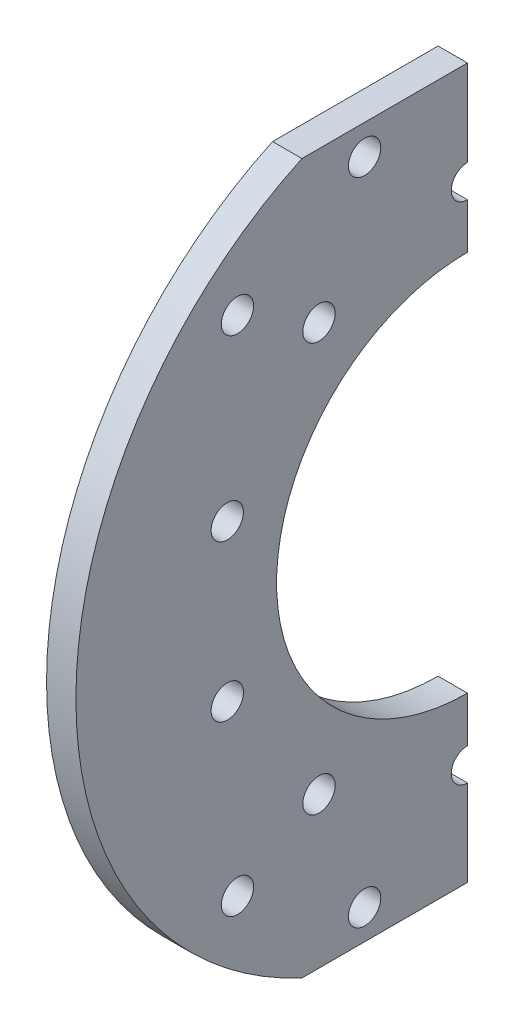
ISO-10303-21;
HEADER;
FILE_DESCRIPTION(('STEP AP214'),'2;1');
FILE_NAME('part.step','',(''),(''),'','','');
FILE_SCHEMA(('AUTOMOTIVE_DESIGN { 1 0 10303 214 1 1 1 1 }'));
ENDSEC;
DATA;
#1=APPLICATION_CONTEXT('core data for automotive mechanical design processes');
#2=APPLICATION_PROTOCOL_DEFINITION('international standard','automotive_design',2000,#1);
#3=PRODUCT_CONTEXT('',#1,'mechanical');
#4=PRODUCT('Part','Part','',(#3));
#5=PRODUCT_RELATED_PRODUCT_CATEGORY('part','',(#4));
#6=PRODUCT_DEFINITION_FORMATION('','',#4);
#7=PRODUCT_DEFINITION_CONTEXT('part definition',#1,'design');
#8=PRODUCT_DEFINITION('design','',#6,#7);
#9=PRODUCT_DEFINITION_SHAPE('','',#8);
#10=(LENGTH_UNIT() NAMED_UNIT(*) SI_UNIT(.MILLI.,.METRE.));
#11=(NAMED_UNIT(*) PLANE_ANGLE_UNIT() SI_UNIT($,.RADIAN.));
#12=(NAMED_UNIT(*) SI_UNIT($,.STERADIAN.) SOLID_ANGLE_UNIT());
#13=UNCERTAINTY_MEASURE_WITH_UNIT(LENGTH_MEASURE(1.E-05),#10,'distance_accuracy_value','');
#14=(GEOMETRIC_REPRESENTATION_CONTEXT(3) GLOBAL_UNCERTAINTY_ASSIGNED_CONTEXT((#13)) GLOBAL_UNIT_ASSIGNED_CONTEXT((#10,
#11,#12)) REPRESENTATION_CONTEXT('',''));
#15=CARTESIAN_POINT('',(0.,0.,0.));
#16=DIRECTION('',(0.,0.,1.));
#17=DIRECTION('',(1.,0.,0.));
#18=AXIS2_PLACEMENT_3D('',#15,#16,#17);
#19=CARTESIAN_POINT('',(0.,0.,0.));
#20=DIRECTION('',(0.,0.,1.));
#21=DIRECTION('',(1.,0.,0.));
#22=AXIS2_PLACEMENT_3D('',#19,#20,#21);
#23=PLANE('',#22);
#24=DIRECTION('',(0.,-1.,0.));
#25=VECTOR('',#24,1.);
#26=CARTESIAN_POINT('',(6.,0.,0.));
#27=LINE('',#26,#25);
#28=CARTESIAN_POINT('',(6.,72.5,0.));
#29=VERTEX_POINT('',#28);
#30=CARTESIAN_POINT('',(6.,54.9,0.));
#31=VERTEX_POINT('',#30);
#32=EDGE_CURVE('E45',#29,#31,#27,.T.);
#33=ORIENTED_EDGE('',*,*,#32,.T.);
#34=DIRECTION('',(-1.,0.,0.));
#35=VECTOR('',#34,1.);
#36=CARTESIAN_POINT('',(6.,54.9,0.));
#37=LINE('',#36,#35);
#38=CARTESIAN_POINT('',(0.,54.9,0.));
#39=VERTEX_POINT('',#38);
#40=EDGE_CURVE('E52',#31,#39,#37,.T.);
#41=ORIENTED_EDGE('',*,*,#40,.T.);
#42=DIRECTION('',(0.,-1.,0.));
#43=VECTOR('',#42,1.);
#44=CARTESIAN_POINT('',(0.,0.,0.));
#45=LINE('',#44,#43);
#46=CARTESIAN_POINT('',(0.,72.5,0.));
#47=VERTEX_POINT('',#46);
#48=EDGE_CURVE('E190',#47,#39,#45,.T.);
#49=ORIENTED_EDGE('',*,*,#48,.F.);
#50=DIRECTION('',(1.,0.,0.));
#51=VECTOR('',#50,1.);
#52=CARTESIAN_POINT('',(6.,72.5,0.));
#53=LINE('',#52,#51);
#54=EDGE_CURVE('E38',#47,#29,#53,.T.);
#55=ORIENTED_EDGE('',*,*,#54,.T.);
#56=EDGE_LOOP('',(#33,#41,#49,#55));
#57=FACE_BOUND('',#56,.T.);
#58=ADVANCED_FACE('F34',(#57),#23,.F.);
#59=CARTESIAN_POINT('',(6.,48.3,0.));
#60=VERTEX_POINT('',#59);
#61=CARTESIAN_POINT('',(6.,39.,0.));
#62=VERTEX_POINT('',#61);
#63=EDGE_CURVE('E250',#60,#62,#27,.T.);
#64=ORIENTED_EDGE('',*,*,#63,.T.);
#65=DIRECTION('',(-1.,0.,0.));
#66=VECTOR('',#65,1.);
#67=CARTESIAN_POINT('',(6.,39.,0.));
#68=LINE('',#67,#66);
#69=CARTESIAN_POINT('',(0.,39.,0.));
#70=VERTEX_POINT('',#69);
#71=EDGE_CURVE('E200',#62,#70,#68,.T.);
#72=ORIENTED_EDGE('',*,*,#71,.T.);
#73=CARTESIAN_POINT('',(0.,48.3,0.));
#74=VERTEX_POINT('',#73);
#75=EDGE_CURVE('E209',#74,#70,#45,.T.);
#76=ORIENTED_EDGE('',*,*,#75,.F.);
#77=DIRECTION('',(-1.,0.,0.));
#78=VECTOR('',#77,1.);
#79=CARTESIAN_POINT('',(6.,48.3,0.));
#80=LINE('',#79,#78);
#81=EDGE_CURVE('E60',#74,#60,#80,.F.);
#82=ORIENTED_EDGE('',*,*,#81,.T.);
#83=EDGE_LOOP('',(#64,#72,#76,#82));
#84=FACE_BOUND('',#83,.T.);
#85=ADVANCED_FACE('F251',(#84),#23,.F.);
#86=CARTESIAN_POINT('',(6.,-39.,0.));
#87=VERTEX_POINT('',#86);
#88=CARTESIAN_POINT('',(6.,-48.3,0.));
#89=VERTEX_POINT('',#88);
#90=EDGE_CURVE('E43',#87,#89,#27,.T.);
#91=ORIENTED_EDGE('',*,*,#90,.T.);
#92=DIRECTION('',(-1.,0.,0.));
#93=VECTOR('',#92,1.);
#94=CARTESIAN_POINT('',(6.,-48.3,0.));
#95=LINE('',#94,#93);
#96=CARTESIAN_POINT('',(0.,-48.3,0.));
#97=VERTEX_POINT('',#96);
#98=EDGE_CURVE('E193',#89,#97,#95,.T.);
#99=ORIENTED_EDGE('',*,*,#98,.T.);
#100=CARTESIAN_POINT('',(0.,-39.,0.));
#101=VERTEX_POINT('',#100);
#102=EDGE_CURVE('E189',#101,#97,#45,.T.);
#103=ORIENTED_EDGE('',*,*,#102,.F.);
#104=DIRECTION('',(-1.,0.,0.));
#105=VECTOR('',#104,1.);
#106=CARTESIAN_POINT('',(6.,-39.,0.));
#107=LINE('',#106,#105);
#108=EDGE_CURVE('E198',#101,#87,#107,.F.);
#109=ORIENTED_EDGE('',*,*,#108,.T.);
#110=EDGE_LOOP('',(#91,#99,#103,#109));
#111=FACE_BOUND('',#110,.T.);
#112=ADVANCED_FACE('F215',(#111),#23,.F.);
#113=CARTESIAN_POINT('',(6.,-54.9,0.));
#114=VERTEX_POINT('',#113);
#115=CARTESIAN_POINT('',(6.,-72.5,0.));
#116=VERTEX_POINT('',#115);
#117=EDGE_CURVE('E11',#114,#116,#27,.T.);
#118=ORIENTED_EDGE('',*,*,#117,.T.);
#119=DIRECTION('',(1.,0.,0.));
#120=VECTOR('',#119,1.);
#121=CARTESIAN_POINT('',(6.,-72.5,0.));
#122=LINE('',#121,#120);
#123=CARTESIAN_POINT('',(0.,-72.5,0.));
#124=VERTEX_POINT('',#123);
#125=EDGE_CURVE('E194',#124,#116,#122,.T.);
#126=ORIENTED_EDGE('',*,*,#125,.F.);
#127=CARTESIAN_POINT('',(0.,-54.9,0.));
#128=VERTEX_POINT('',#127);
#129=EDGE_CURVE('E126',#128,#124,#45,.T.);
#130=ORIENTED_EDGE('',*,*,#129,.F.);
#131=DIRECTION('',(-1.,0.,0.));
#132=VECTOR('',#131,1.);
#133=CARTESIAN_POINT('',(6.,-54.9,0.));
#134=LINE('',#133,#132);
#135=EDGE_CURVE('E191',#128,#114,#134,.F.);
#136=ORIENTED_EDGE('',*,*,#135,.T.);
#137=EDGE_LOOP('',(#118,#126,#130,#136));
#138=FACE_BOUND('',#137,.T.);
#139=ADVANCED_FACE('F36',(#138),#23,.F.);
#140=CARTESIAN_POINT('',(6.,41.7452769097473,30.3297190182916));
#141=DIRECTION('',(-1.,0.,0.));
#142=DIRECTION('',(0.,0.,1.));
#143=AXIS2_PLACEMENT_3D('',#140,#141,#142);
#144=CYLINDRICAL_SURFACE('',#143,3.3);
#145=CARTESIAN_POINT('',(6.,41.7452769097473,30.3297190182916));
#146=DIRECTION('',(1.,0.,0.));
#147=DIRECTION('',(0.,0.,-1.));
#148=AXIS2_PLACEMENT_3D('',#145,#146,#147);
#149=CIRCLE('',#148,3.3);
#150=CARTESIAN_POINT('',(6.,41.7452769097473,27.0297190182916));
#151=VERTEX_POINT('',#150);
#152=EDGE_CURVE('E246',#151,#151,#149,.T.);
#153=ORIENTED_EDGE('',*,*,#152,.T.);
#154=EDGE_LOOP('',(#153));
#155=FACE_BOUND('',#154,.T.);
#156=CARTESIAN_POINT('',(0.,41.7452769097473,30.3297190182916));
#157=DIRECTION('',(1.,0.,0.));
#158=DIRECTION('',(0.,0.,-1.));
#159=AXIS2_PLACEMENT_3D('',#156,#157,#158);
#160=CIRCLE('',#159,3.3);
#161=CARTESIAN_POINT('',(0.,41.7452769097473,27.0297190182916));
#162=VERTEX_POINT('',#161);
#163=EDGE_CURVE('E174',#162,#162,#160,.T.);
#164=ORIENTED_EDGE('',*,*,#163,.F.);
#165=EDGE_LOOP('',(#164));
#166=FACE_BOUND('',#165,.T.);
#167=ADVANCED_FACE('F260',(#155,#166),#144,.F.);
#168=CARTESIAN_POINT('',(6.,15.9452769097473,49.0745162408299));
#169=DIRECTION('',(-1.,0.,0.));
#170=DIRECTION('',(0.,0.,1.));
#171=AXIS2_PLACEMENT_3D('',#168,#169,#170);
#172=CYLINDRICAL_SURFACE('',#171,3.3);
#173=CARTESIAN_POINT('',(6.,15.9452769097473,49.0745162408299));
#174=DIRECTION('',(1.,0.,0.));
#175=DIRECTION('',(0.,0.,-1.));
#176=AXIS2_PLACEMENT_3D('',#173,#174,#175);
#177=CIRCLE('',#176,3.3);
#178=CARTESIAN_POINT('',(6.,15.9452769097473,45.7745162408299));
#179=VERTEX_POINT('',#178);
#180=EDGE_CURVE('E243',#179,#179,#177,.T.);
#181=ORIENTED_EDGE('',*,*,#180,.T.);
#182=EDGE_LOOP('',(#181));
#183=FACE_BOUND('',#182,.T.);
#184=CARTESIAN_POINT('',(0.,15.9452769097473,49.0745162408299));
#185=DIRECTION('',(1.,0.,0.));
#186=DIRECTION('',(0.,0.,-1.));
#187=AXIS2_PLACEMENT_3D('',#184,#185,#186);
#188=CIRCLE('',#187,3.3);
#189=CARTESIAN_POINT('',(0.,15.9452769097473,45.7745162408299));
#190=VERTEX_POINT('',#189);
#191=EDGE_CURVE('E171',#190,#190,#188,.T.);
#192=ORIENTED_EDGE('',*,*,#191,.F.);
#193=EDGE_LOOP('',(#192));
#194=FACE_BOUND('',#193,.T.);
#195=ADVANCED_FACE('F264',(#183,#194),#172,.F.);
#196=CARTESIAN_POINT('',(6.,-15.9452769097473,49.0745162408299));
#197=DIRECTION('',(-1.,0.,0.));
#198=DIRECTION('',(0.,0.,1.));
#199=AXIS2_PLACEMENT_3D('',#196,#197,#198);
#200=CYLINDRICAL_SURFACE('',#199,3.3);
#201=CARTESIAN_POINT('',(6.,-15.9452769097473,49.0745162408299));
#202=DIRECTION('',(1.,0.,0.));
#203=DIRECTION('',(0.,0.,-1.));
#204=AXIS2_PLACEMENT_3D('',#201,#202,#203);
#205=CIRCLE('',#204,3.3);
#206=CARTESIAN_POINT('',(6.,-15.9452769097473,45.7745162408299));
#207=VERTEX_POINT('',#206);
#208=EDGE_CURVE('E235',#207,#207,#205,.T.);
#209=ORIENTED_EDGE('',*,*,#208,.T.);
#210=EDGE_LOOP('',(#209));
#211=FACE_BOUND('',#210,.T.);
#212=CARTESIAN_POINT('',(0.,-15.9452769097473,49.0745162408299));
#213=DIRECTION('',(1.,0.,0.));
#214=DIRECTION('',(0.,0.,-1.));
#215=AXIS2_PLACEMENT_3D('',#212,#213,#214);
#216=CIRCLE('',#215,3.3);
#217=CARTESIAN_POINT('',(0.,-15.9452769097473,45.7745162408299));
#218=VERTEX_POINT('',#217);
#219=EDGE_CURVE('E168',#218,#218,#216,.T.);
#220=ORIENTED_EDGE('',*,*,#219,.F.);
#221=EDGE_LOOP('',(#220));
#222=FACE_BOUND('',#221,.T.);
#223=ADVANCED_FACE('F288',(#211,#222),#200,.F.);
#224=CARTESIAN_POINT('',(6.,-41.7452769097473,30.3297190182916));
#225=DIRECTION('',(-1.,0.,0.));
#226=DIRECTION('',(0.,0.,1.));
#227=AXIS2_PLACEMENT_3D('',#224,#225,#226);
#228=CYLINDRICAL_SURFACE('',#227,3.30000000000001);
#229=CARTESIAN_POINT('',(6.,-41.7452769097473,30.3297190182916));
#230=DIRECTION('',(1.,0.,0.));
#231=DIRECTION('',(0.,0.,-1.));
#232=AXIS2_PLACEMENT_3D('',#229,#230,#231);
#233=CIRCLE('',#232,3.30000000000001);
#234=CARTESIAN_POINT('',(6.,-41.7452769097473,27.0297190182916));
#235=VERTEX_POINT('',#234);
#236=EDGE_CURVE('E231',#235,#235,#233,.T.);
#237=ORIENTED_EDGE('',*,*,#236,.T.);
#238=EDGE_LOOP('',(#237));
#239=FACE_BOUND('',#238,.T.);
#240=CARTESIAN_POINT('',(0.,-41.7452769097473,30.3297190182916));
#241=DIRECTION('',(1.,0.,0.));
#242=DIRECTION('',(0.,0.,-1.));
#243=AXIS2_PLACEMENT_3D('',#240,#241,#242);
#244=CIRCLE('',#243,3.30000000000001);
#245=CARTESIAN_POINT('',(0.,-41.7452769097473,27.0297190182916));
#246=VERTEX_POINT('',#245);
#247=EDGE_CURVE('E165',#246,#246,#244,.T.);
#248=ORIENTED_EDGE('',*,*,#247,.F.);
#249=EDGE_LOOP('',(#248));
#250=FACE_BOUND('',#249,.T.);
#251=ADVANCED_FACE('F278',(#239,#250),#228,.F.);
#252=CARTESIAN_POINT('',(6.,0.,0.));
#253=DIRECTION('',(-1.,0.,0.));
#254=DIRECTION('',(0.,0.,1.));
#255=AXIS2_PLACEMENT_3D('',#252,#253,#254);
#256=CYLINDRICAL_SURFACE('',#255,80.);
#257=CARTESIAN_POINT('',(0.,0.,0.));
#258=DIRECTION('',(1.,0.,0.));
#259=DIRECTION('',(0.,0.,-1.));
#260=AXIS2_PLACEMENT_3D('',#257,#258,#259);
#261=CIRCLE('',#260,80.);
#262=CARTESIAN_POINT('',(0.,72.5,33.8193731461717));
#263=VERTEX_POINT('',#262);
#264=CARTESIAN_POINT('',(0.,-72.5,33.8193731461717));
#265=VERTEX_POINT('',#264);
#266=EDGE_CURVE('E184',#263,#265,#261,.T.);
#267=ORIENTED_EDGE('',*,*,#266,.T.);
#268=DIRECTION('',(-1.,0.,0.));
#269=VECTOR('',#268,1.);
#270=CARTESIAN_POINT('',(6.,-72.5,33.8193731461717));
#271=LINE('',#270,#269);
#272=CARTESIAN_POINT('',(6.,-72.5,33.8193731461717));
#273=VERTEX_POINT('',#272);
#274=EDGE_CURVE('E127',#273,#265,#271,.T.);
#275=ORIENTED_EDGE('',*,*,#274,.F.);
#276=CARTESIAN_POINT('',(6.,0.,0.));
#277=DIRECTION('',(1.,0.,0.));
#278=DIRECTION('',(0.,0.,-1.));
#279=AXIS2_PLACEMENT_3D('',#276,#277,#278);
#280=CIRCLE('',#279,80.);
#281=CARTESIAN_POINT('',(6.,72.5,33.8193731461717));
#282=VERTEX_POINT('',#281);
#283=EDGE_CURVE('E130',#282,#273,#280,.T.);
#284=ORIENTED_EDGE('',*,*,#283,.F.);
#285=DIRECTION('',(-1.,0.,0.));
#286=VECTOR('',#285,1.);
#287=CARTESIAN_POINT('',(6.,72.5,33.8193731461717));
#288=LINE('',#287,#286);
#289=EDGE_CURVE('E117',#282,#263,#288,.T.);
#290=ORIENTED_EDGE('',*,*,#289,.T.);
#291=EDGE_LOOP('',(#267,#275,#284,#290));
#292=FACE_BOUND('',#291,.T.);
#293=ADVANCED_FACE('F131',(#292),#256,.T.);
#294=CARTESIAN_POINT('',(6.,-72.5,0.));
#295=DIRECTION('',(0.,1.,0.));
#296=DIRECTION('',(0.,0.,1.));
#297=AXIS2_PLACEMENT_3D('',#294,#295,#296);
#298=PLANE('',#297);
#299=DIRECTION('',(0.,0.,-1.));
#300=VECTOR('',#299,1.);
#301=CARTESIAN_POINT('',(0.,-72.5,0.));
#302=LINE('',#301,#300);
#303=EDGE_CURVE('E180',#265,#124,#302,.T.);
#304=ORIENTED_EDGE('',*,*,#303,.T.);
#305=ORIENTED_EDGE('',*,*,#125,.T.);
#306=DIRECTION('',(0.,0.,-1.));
#307=VECTOR('',#306,1.);
#308=CARTESIAN_POINT('',(6.,-72.5,0.));
#309=LINE('',#308,#307);
#310=EDGE_CURVE('E141',#273,#116,#309,.T.);
#311=ORIENTED_EDGE('',*,*,#310,.F.);
#312=ORIENTED_EDGE('',*,*,#274,.T.);
#313=EDGE_LOOP('',(#304,#305,#311,#312));
#314=FACE_BOUND('',#313,.T.);
#315=ADVANCED_FACE('F228',(#314),#298,.F.);
#316=CARTESIAN_POINT('',(6.,-51.6,0.));
#317=DIRECTION('',(-1.,0.,0.));
#318=DIRECTION('',(0.,0.,1.));
#319=AXIS2_PLACEMENT_3D('',#316,#317,#318);
#320=CYLINDRICAL_SURFACE('',#319,3.29999999999999);
#321=ORIENTED_EDGE('',*,*,#98,.F.);
#322=CARTESIAN_POINT('',(6.,-51.6,0.));
#323=DIRECTION('',(1.,0.,0.));
#324=DIRECTION('',(0.,0.,-1.));
#325=AXIS2_PLACEMENT_3D('',#322,#323,#324);
#326=CIRCLE('',#325,3.29999999999999);
#327=EDGE_CURVE('E222',#89,#114,#326,.T.);
#328=ORIENTED_EDGE('',*,*,#327,.T.);
#329=ORIENTED_EDGE('',*,*,#135,.F.);
#330=CARTESIAN_POINT('',(0.,-51.6,0.));
#331=DIRECTION('',(1.,0.,0.));
#332=DIRECTION('',(0.,0.,-1.));
#333=AXIS2_PLACEMENT_3D('',#330,#331,#332);
#334=CIRCLE('',#333,3.29999999999999);
#335=EDGE_CURVE('E162',#97,#128,#334,.T.);
#336=ORIENTED_EDGE('',*,*,#335,.F.);
#337=EDGE_LOOP('',(#321,#328,#329,#336));
#338=FACE_BOUND('',#337,.T.);
#339=ADVANCED_FACE('F220',(#338),#320,.F.);
#340=CARTESIAN_POINT('',(6.,0.,0.));
#341=DIRECTION('',(-1.,0.,0.));
#342=DIRECTION('',(0.,0.,1.));
#343=AXIS2_PLACEMENT_3D('',#340,#341,#342);
#344=CYLINDRICAL_SURFACE('',#343,39.);
#345=ORIENTED_EDGE('',*,*,#71,.F.);
#346=CARTESIAN_POINT('',(6.,0.,0.));
#347=DIRECTION('',(1.,0.,0.));
#348=DIRECTION('',(0.,0.,-1.));
#349=AXIS2_PLACEMENT_3D('',#346,#347,#348);
#350=CIRCLE('',#349,39.);
#351=EDGE_CURVE('E143',#62,#87,#350,.T.);
#352=ORIENTED_EDGE('',*,*,#351,.T.);
#353=ORIENTED_EDGE('',*,*,#108,.F.);
#354=CARTESIAN_POINT('',(0.,0.,0.));
#355=DIRECTION('',(1.,0.,0.));
#356=DIRECTION('',(0.,0.,-1.));
#357=AXIS2_PLACEMENT_3D('',#354,#355,#356);
#358=CIRCLE('',#357,39.);
#359=EDGE_CURVE('E177',#70,#101,#358,.T.);
#360=ORIENTED_EDGE('',*,*,#359,.F.);
#361=EDGE_LOOP('',(#345,#352,#353,#360));
#362=FACE_BOUND('',#361,.T.);
#363=ADVANCED_FACE('F249',(#362),#344,.F.);
#364=CARTESIAN_POINT('',(6.,51.6,0.));
#365=DIRECTION('',(-1.,0.,0.));
#366=DIRECTION('',(0.,0.,1.));
#367=AXIS2_PLACEMENT_3D('',#364,#365,#366);
#368=CYLINDRICAL_SURFACE('',#367,3.3);
#369=ORIENTED_EDGE('',*,*,#40,.F.);
#370=CARTESIAN_POINT('',(6.,51.6,0.));
#371=DIRECTION('',(1.,0.,0.));
#372=DIRECTION('',(0.,0.,-1.));
#373=AXIS2_PLACEMENT_3D('',#370,#371,#372);
#374=CIRCLE('',#373,3.3);
#375=EDGE_CURVE('E232',#31,#60,#374,.T.);
#376=ORIENTED_EDGE('',*,*,#375,.T.);
#377=ORIENTED_EDGE('',*,*,#81,.F.);
#378=CARTESIAN_POINT('',(0.,51.6,0.));
#379=DIRECTION('',(1.,0.,0.));
#380=DIRECTION('',(0.,0.,-1.));
#381=AXIS2_PLACEMENT_3D('',#378,#379,#380);
#382=CIRCLE('',#381,3.3);
#383=EDGE_CURVE('E159',#39,#74,#382,.T.);
#384=ORIENTED_EDGE('',*,*,#383,.F.);
#385=EDGE_LOOP('',(#369,#376,#377,#384));
#386=FACE_BOUND('',#385,.T.);
#387=ADVANCED_FACE('F205',(#386),#368,.F.);
#388=CARTESIAN_POINT('',(6.,72.5,0.));
#389=DIRECTION('',(0.,1.,0.));
#390=DIRECTION('',(0.,0.,1.));
#391=AXIS2_PLACEMENT_3D('',#388,#389,#390);
#392=PLANE('',#391);
#393=ORIENTED_EDGE('',*,*,#54,.F.);
#394=DIRECTION('',(0.,0.,-1.));
#395=VECTOR('',#394,1.);
#396=CARTESIAN_POINT('',(0.,72.5,0.));
#397=LINE('',#396,#395);
#398=EDGE_CURVE('E123',#263,#47,#397,.T.);
#399=ORIENTED_EDGE('',*,*,#398,.F.);
#400=ORIENTED_EDGE('',*,*,#289,.F.);
#401=DIRECTION('',(0.,0.,-1.));
#402=VECTOR('',#401,1.);
#403=CARTESIAN_POINT('',(6.,72.5,0.));
#404=LINE('',#403,#402);
#405=EDGE_CURVE('E121',#282,#29,#404,.T.);
#406=ORIENTED_EDGE('',*,*,#405,.T.);
#407=EDGE_LOOP('',(#393,#399,#400,#406));
#408=FACE_BOUND('',#407,.T.);
#409=ADVANCED_FACE('F119',(#408),#392,.T.);
#410=CARTESIAN_POINT('',(6.,-51.3897274573418,46.9903810567666));
#411=DIRECTION('',(-1.,0.,0.));
#412=DIRECTION('',(0.,0.,1.));
#413=AXIS2_PLACEMENT_3D('',#410,#411,#412);
#414=CYLINDRICAL_SURFACE('',#413,3.30000000000001);
#415=CARTESIAN_POINT('',(6.,-51.3897274573418,46.9903810567666));
#416=DIRECTION('',(1.,0.,0.));
#417=DIRECTION('',(0.,0.,-1.));
#418=AXIS2_PLACEMENT_3D('',#415,#416,#417);
#419=CIRCLE('',#418,3.30000000000001);
#420=CARTESIAN_POINT('',(6.,-51.3897274573418,43.6903810567666));
#421=VERTEX_POINT('',#420);
#422=EDGE_CURVE('E237',#421,#421,#419,.T.);
#423=ORIENTED_EDGE('',*,*,#422,.T.);
#424=EDGE_LOOP('',(#423));
#425=FACE_BOUND('',#424,.T.);
#426=CARTESIAN_POINT('',(0.,-51.3897274573418,46.9903810567666));
#427=DIRECTION('',(1.,0.,0.));
#428=DIRECTION('',(0.,0.,-1.));
#429=AXIS2_PLACEMENT_3D('',#426,#427,#428);
#430=CIRCLE('',#429,3.30000000000001);
#431=CARTESIAN_POINT('',(0.,-51.3897274573418,43.6903810567666));
#432=VERTEX_POINT('',#431);
#433=EDGE_CURVE('E156',#432,#432,#430,.T.);
#434=ORIENTED_EDGE('',*,*,#433,.F.);
#435=EDGE_LOOP('',(#434));
#436=FACE_BOUND('',#435,.T.);
#437=ADVANCED_FACE('F281',(#425,#436),#414,.F.);
#438=CARTESIAN_POINT('',(6.,-66.3897274573418,21.0096189432334));
#439=DIRECTION('',(-1.,0.,0.));
#440=DIRECTION('',(0.,0.,1.));
#441=AXIS2_PLACEMENT_3D('',#438,#439,#440);
#442=CYLINDRICAL_SURFACE('',#441,3.30000000000001);
#443=CARTESIAN_POINT('',(6.,-66.3897274573418,21.0096189432334));
#444=DIRECTION('',(1.,0.,0.));
#445=DIRECTION('',(0.,0.,-1.));
#446=AXIS2_PLACEMENT_3D('',#443,#444,#445);
#447=CIRCLE('',#446,3.30000000000001);
#448=CARTESIAN_POINT('',(6.,-66.3897274573418,17.7096189432334));
#449=VERTEX_POINT('',#448);
#450=EDGE_CURVE('E330',#449,#449,#447,.T.);
#451=ORIENTED_EDGE('',*,*,#450,.T.);
#452=EDGE_LOOP('',(#451));
#453=FACE_BOUND('',#452,.T.);
#454=CARTESIAN_POINT('',(0.,-66.3897274573418,21.0096189432334));
#455=DIRECTION('',(1.,0.,0.));
#456=DIRECTION('',(0.,0.,-1.));
#457=AXIS2_PLACEMENT_3D('',#454,#455,#456);
#458=CIRCLE('',#457,3.30000000000001);
#459=CARTESIAN_POINT('',(0.,-66.3897274573418,17.7096189432334));
#460=VERTEX_POINT('',#459);
#461=EDGE_CURVE('E153',#460,#460,#458,.T.);
#462=ORIENTED_EDGE('',*,*,#461,.F.);
#463=EDGE_LOOP('',(#462));
#464=FACE_BOUND('',#463,.T.);
#465=ADVANCED_FACE('F302',(#453,#464),#442,.F.);
#466=CARTESIAN_POINT('',(6.,66.3897274573418,21.0096189432335));
#467=DIRECTION('',(-1.,0.,0.));
#468=DIRECTION('',(0.,0.,1.));
#469=AXIS2_PLACEMENT_3D('',#466,#467,#468);
#470=CYLINDRICAL_SURFACE('',#469,3.3);
#471=CARTESIAN_POINT('',(6.,66.3897274573418,21.0096189432335));
#472=DIRECTION('',(1.,0.,0.));
#473=DIRECTION('',(0.,0.,-1.));
#474=AXIS2_PLACEMENT_3D('',#471,#472,#473);
#475=CIRCLE('',#474,3.3);
#476=CARTESIAN_POINT('',(6.,66.3897274573418,17.7096189432335));
#477=VERTEX_POINT('',#476);
#478=EDGE_CURVE('E327',#477,#477,#475,.T.);
#479=ORIENTED_EDGE('',*,*,#478,.T.);
#480=EDGE_LOOP('',(#479));
#481=FACE_BOUND('',#480,.T.);
#482=CARTESIAN_POINT('',(0.,66.3897274573418,21.0096189432335));
#483=DIRECTION('',(1.,0.,0.));
#484=DIRECTION('',(0.,0.,-1.));
#485=AXIS2_PLACEMENT_3D('',#482,#483,#484);
#486=CIRCLE('',#485,3.3);
#487=CARTESIAN_POINT('',(0.,66.3897274573418,17.7096189432335));
#488=VERTEX_POINT('',#487);
#489=EDGE_CURVE('E150',#488,#488,#486,.T.);
#490=ORIENTED_EDGE('',*,*,#489,.F.);
#491=EDGE_LOOP('',(#490));
#492=FACE_BOUND('',#491,.T.);
#493=ADVANCED_FACE('F306',(#481,#492),#470,.F.);
#494=CARTESIAN_POINT('',(6.,51.3897274573418,46.9903810567666));
#495=DIRECTION('',(-1.,0.,0.));
#496=DIRECTION('',(0.,0.,1.));
#497=AXIS2_PLACEMENT_3D('',#494,#495,#496);
#498=CYLINDRICAL_SURFACE('',#497,3.30000000000001);
#499=CARTESIAN_POINT('',(6.,51.3897274573418,46.9903810567666));
#500=DIRECTION('',(1.,0.,0.));
#501=DIRECTION('',(0.,0.,-1.));
#502=AXIS2_PLACEMENT_3D('',#499,#500,#501);
#503=CIRCLE('',#502,3.30000000000001);
#504=CARTESIAN_POINT('',(6.,51.3897274573418,43.6903810567666));
#505=VERTEX_POINT('',#504);
#506=EDGE_CURVE('E186',#505,#505,#503,.T.);
#507=ORIENTED_EDGE('',*,*,#506,.T.);
#508=EDGE_LOOP('',(#507));
#509=FACE_BOUND('',#508,.T.);
#510=CARTESIAN_POINT('',(0.,51.3897274573418,46.9903810567666));
#511=DIRECTION('',(1.,0.,0.));
#512=DIRECTION('',(0.,0.,-1.));
#513=AXIS2_PLACEMENT_3D('',#510,#511,#512);
#514=CIRCLE('',#513,3.30000000000001);
#515=CARTESIAN_POINT('',(0.,51.3897274573418,43.6903810567666));
#516=VERTEX_POINT('',#515);
#517=EDGE_CURVE('E147',#516,#516,#514,.T.);
#518=ORIENTED_EDGE('',*,*,#517,.F.);
#519=EDGE_LOOP('',(#518));
#520=FACE_BOUND('',#519,.T.);
#521=ADVANCED_FACE('F272',(#509,#520),#498,.F.);
#522=CARTESIAN_POINT('',(0.,0.,0.));
#523=DIRECTION('',(1.,0.,0.));
#524=DIRECTION('',(0.,0.,-1.));
#525=AXIS2_PLACEMENT_3D('',#522,#523,#524);
#526=PLANE('',#525);
#527=ORIENTED_EDGE('',*,*,#517,.T.);
#528=EDGE_LOOP('',(#527));
#529=FACE_BOUND('',#528,.T.);
#530=ORIENTED_EDGE('',*,*,#489,.T.);
#531=EDGE_LOOP('',(#530));
#532=FACE_BOUND('',#531,.T.);
#533=ORIENTED_EDGE('',*,*,#461,.T.);
#534=EDGE_LOOP('',(#533));
#535=FACE_BOUND('',#534,.T.);
#536=ORIENTED_EDGE('',*,*,#433,.T.);
#537=EDGE_LOOP('',(#536));
#538=FACE_BOUND('',#537,.T.);
#539=ORIENTED_EDGE('',*,*,#398,.T.);
#540=ORIENTED_EDGE('',*,*,#48,.T.);
#541=ORIENTED_EDGE('',*,*,#383,.T.);
#542=ORIENTED_EDGE('',*,*,#75,.T.);
#543=ORIENTED_EDGE('',*,*,#359,.T.);
#544=ORIENTED_EDGE('',*,*,#102,.T.);
#545=ORIENTED_EDGE('',*,*,#335,.T.);
#546=ORIENTED_EDGE('',*,*,#129,.T.);
#547=ORIENTED_EDGE('',*,*,#303,.F.);
#548=ORIENTED_EDGE('',*,*,#266,.F.);
#549=EDGE_LOOP('',(#539,#540,#541,#542,#543,#544,#545,#546,#547,#548));
#550=FACE_BOUND('',#549,.T.);
#551=ORIENTED_EDGE('',*,*,#247,.T.);
#552=EDGE_LOOP('',(#551));
#553=FACE_BOUND('',#552,.T.);
#554=ORIENTED_EDGE('',*,*,#219,.T.);
#555=EDGE_LOOP('',(#554));
#556=FACE_BOUND('',#555,.T.);
#557=ORIENTED_EDGE('',*,*,#191,.T.);
#558=EDGE_LOOP('',(#557));
#559=FACE_BOUND('',#558,.T.);
#560=ORIENTED_EDGE('',*,*,#163,.T.);
#561=EDGE_LOOP('',(#560));
#562=FACE_BOUND('',#561,.T.);
#563=ADVANCED_FACE('F207',(#529,#532,#535,#538,#550,#553,#556,#559,#562),#526,.F.);
#564=CARTESIAN_POINT('',(6.,0.,0.));
#565=DIRECTION('',(1.,0.,0.));
#566=DIRECTION('',(0.,0.,-1.));
#567=AXIS2_PLACEMENT_3D('',#564,#565,#566);
#568=PLANE('',#567);
#569=ORIENTED_EDGE('',*,*,#32,.F.);
#570=ORIENTED_EDGE('',*,*,#405,.F.);
#571=ORIENTED_EDGE('',*,*,#283,.T.);
#572=ORIENTED_EDGE('',*,*,#310,.T.);
#573=ORIENTED_EDGE('',*,*,#117,.F.);
#574=ORIENTED_EDGE('',*,*,#327,.F.);
#575=ORIENTED_EDGE('',*,*,#90,.F.);
#576=ORIENTED_EDGE('',*,*,#351,.F.);
#577=ORIENTED_EDGE('',*,*,#63,.F.);
#578=ORIENTED_EDGE('',*,*,#375,.F.);
#579=EDGE_LOOP('',(#569,#570,#571,#572,#573,#574,#575,#576,#577,#578));
#580=FACE_BOUND('',#579,.T.);
#581=ORIENTED_EDGE('',*,*,#506,.F.);
#582=EDGE_LOOP('',(#581));
#583=FACE_BOUND('',#582,.T.);
#584=ORIENTED_EDGE('',*,*,#478,.F.);
#585=EDGE_LOOP('',(#584));
#586=FACE_BOUND('',#585,.T.);
#587=ORIENTED_EDGE('',*,*,#450,.F.);
#588=EDGE_LOOP('',(#587));
#589=FACE_BOUND('',#588,.T.);
#590=ORIENTED_EDGE('',*,*,#422,.F.);
#591=EDGE_LOOP('',(#590));
#592=FACE_BOUND('',#591,.T.);
#593=ORIENTED_EDGE('',*,*,#236,.F.);
#594=EDGE_LOOP('',(#593));
#595=FACE_BOUND('',#594,.T.);
#596=ORIENTED_EDGE('',*,*,#208,.F.);
#597=EDGE_LOOP('',(#596));
#598=FACE_BOUND('',#597,.T.);
#599=ORIENTED_EDGE('',*,*,#180,.F.);
#600=EDGE_LOOP('',(#599));
#601=FACE_BOUND('',#600,.T.);
#602=ORIENTED_EDGE('',*,*,#152,.F.);
#603=EDGE_LOOP('',(#602));
#604=FACE_BOUND('',#603,.T.);
#605=ADVANCED_FACE('F138',(#580,#583,#586,#589,#592,#595,#598,#601,#604),#568,.T.);
#606=CLOSED_SHELL('',(#58,#85,#112,#139,#167,#195,#223,#251,#293,#315,#339,#363,#387,#409,#437,
#465,#493,#521,#563,#605));
#607=MANIFOLD_SOLID_BREP('B2',#606);
#608=ADVANCED_BREP_SHAPE_REPRESENTATION('',(#18,#607),#14);
#609=SHAPE_DEFINITION_REPRESENTATION(#9,#608);
ENDSEC;
END-ISO-10303-21;
